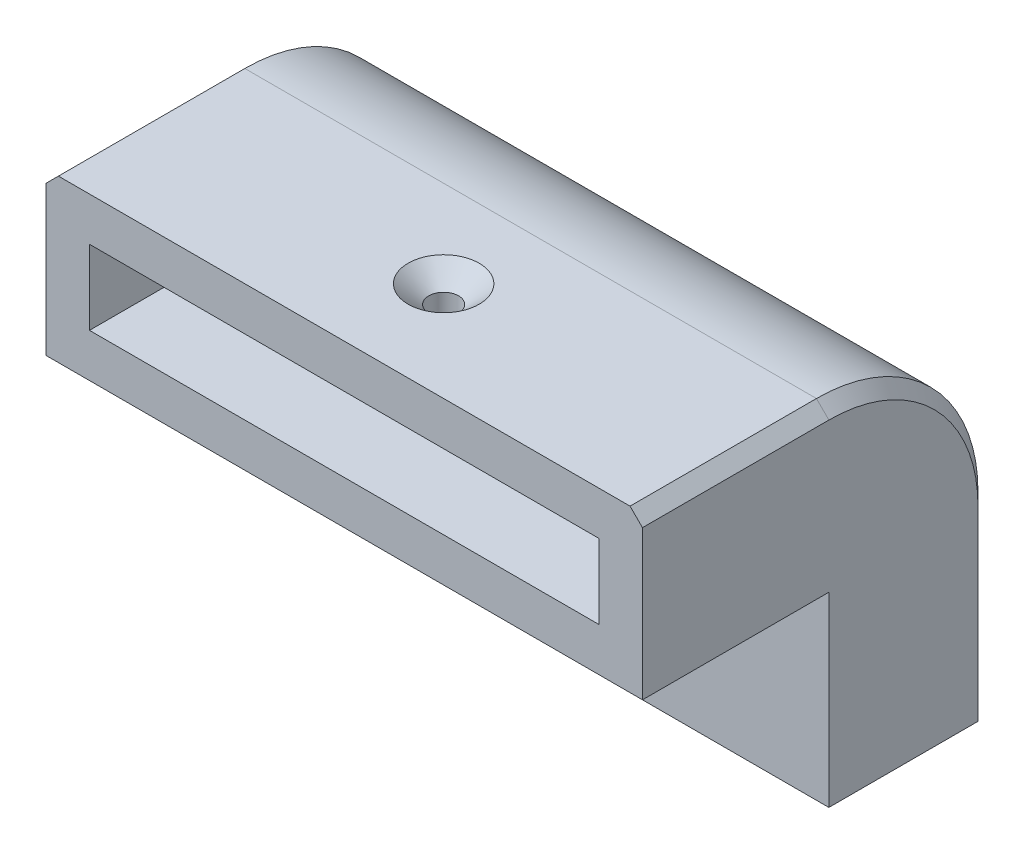
ISO-10303-21;
HEADER;
FILE_DESCRIPTION(('STEP AP214'),'2;1');
FILE_NAME('part.step','',(''),(''),'','','');
FILE_SCHEMA(('AUTOMOTIVE_DESIGN { 1 0 10303 214 1 1 1 1 }'));
ENDSEC;
DATA;
#1=APPLICATION_CONTEXT('core data for automotive mechanical design processes');
#2=APPLICATION_PROTOCOL_DEFINITION('international standard','automotive_design',2000,#1);
#3=PRODUCT_CONTEXT('',#1,'mechanical');
#4=PRODUCT('Part','Part','',(#3));
#5=PRODUCT_RELATED_PRODUCT_CATEGORY('part','',(#4));
#6=PRODUCT_DEFINITION_FORMATION('','',#4);
#7=PRODUCT_DEFINITION_CONTEXT('part definition',#1,'design');
#8=PRODUCT_DEFINITION('design','',#6,#7);
#9=PRODUCT_DEFINITION_SHAPE('','',#8);
#10=(LENGTH_UNIT() NAMED_UNIT(*) SI_UNIT(.MILLI.,.METRE.));
#11=(NAMED_UNIT(*) PLANE_ANGLE_UNIT() SI_UNIT($,.RADIAN.));
#12=(NAMED_UNIT(*) SI_UNIT($,.STERADIAN.) SOLID_ANGLE_UNIT());
#13=UNCERTAINTY_MEASURE_WITH_UNIT(LENGTH_MEASURE(1.E-05),#10,'distance_accuracy_value','');
#14=(GEOMETRIC_REPRESENTATION_CONTEXT(3) GLOBAL_UNCERTAINTY_ASSIGNED_CONTEXT((#13)) GLOBAL_UNIT_ASSIGNED_CONTEXT((#10,
#11,#12)) REPRESENTATION_CONTEXT('',''));
#15=CARTESIAN_POINT('',(0.,0.,0.));
#16=DIRECTION('',(0.,0.,1.));
#17=DIRECTION('',(1.,0.,0.));
#18=AXIS2_PLACEMENT_3D('',#15,#16,#17);
#19=CARTESIAN_POINT('',(0.,0.,0.));
#20=DIRECTION('',(0.,1.,0.));
#21=DIRECTION('',(0.,0.,1.));
#22=AXIS2_PLACEMENT_3D('',#19,#20,#21);
#23=PLANE('',#22);
#24=DIRECTION('',(0.,0.,1.));
#25=VECTOR('',#24,1.);
#26=CARTESIAN_POINT('',(26.035,0.,-3.81));
#27=LINE('',#26,#25);
#28=CARTESIAN_POINT('',(26.035,0.,-3.81));
#29=VERTEX_POINT('',#28);
#30=CARTESIAN_POINT('',(26.035,0.,3.81));
#31=VERTEX_POINT('',#30);
#32=EDGE_CURVE('E199',#29,#31,#27,.T.);
#33=ORIENTED_EDGE('',*,*,#32,.F.);
#34=DIRECTION('',(1.,0.,0.));
#35=VECTOR('',#34,1.);
#36=CARTESIAN_POINT('',(-26.035,0.,-3.81));
#37=LINE('',#36,#35);
#38=CARTESIAN_POINT('',(-26.035,0.,-3.81));
#39=VERTEX_POINT('',#38);
#40=EDGE_CURVE('E173',#39,#29,#37,.T.);
#41=ORIENTED_EDGE('',*,*,#40,.F.);
#42=DIRECTION('',(0.,0.,-1.));
#43=VECTOR('',#42,1.);
#44=CARTESIAN_POINT('',(-26.035,0.,3.81));
#45=LINE('',#44,#43);
#46=CARTESIAN_POINT('',(-26.035,0.,3.81));
#47=VERTEX_POINT('',#46);
#48=EDGE_CURVE('E190',#47,#39,#45,.T.);
#49=ORIENTED_EDGE('',*,*,#48,.F.);
#50=DIRECTION('',(-1.,0.,0.));
#51=VECTOR('',#50,1.);
#52=CARTESIAN_POINT('',(26.035,0.,3.81));
#53=LINE('',#52,#51);
#54=EDGE_CURVE('E193',#31,#47,#53,.T.);
#55=ORIENTED_EDGE('',*,*,#54,.F.);
#56=EDGE_LOOP('',(#33,#41,#49,#55));
#57=FACE_BOUND('',#56,.T.);
#58=DIRECTION('',(-1.,0.,0.));
#59=VECTOR('',#58,1.);
#60=CARTESIAN_POINT('',(-30.48,0.,-8.255));
#61=LINE('',#60,#59);
#62=CARTESIAN_POINT('',(29.21,0.,-8.25500000000001));
#63=VERTEX_POINT('',#62);
#64=CARTESIAN_POINT('',(-29.21,0.,-8.255));
#65=VERTEX_POINT('',#64);
#66=EDGE_CURVE('E391',#63,#65,#61,.T.);
#67=ORIENTED_EDGE('',*,*,#66,.F.);
#68=DIRECTION('',(-0.70710678118655,0.,-0.707106781186546));
#69=VECTOR('',#68,1.);
#70=CARTESIAN_POINT('',(29.21,0.,-8.255));
#71=LINE('',#70,#69);
#72=CARTESIAN_POINT('',(30.48,0.,-6.985));
#73=VERTEX_POINT('',#72);
#74=EDGE_CURVE('E341',#63,#73,#71,.F.);
#75=ORIENTED_EDGE('',*,*,#74,.T.);
#76=DIRECTION('',(0.,0.,-1.));
#77=VECTOR('',#76,1.);
#78=CARTESIAN_POINT('',(30.48,0.,-8.255));
#79=LINE('',#78,#77);
#80=CARTESIAN_POINT('',(30.48,0.,8.255));
#81=VERTEX_POINT('',#80);
#82=EDGE_CURVE('E349',#81,#73,#79,.T.);
#83=ORIENTED_EDGE('',*,*,#82,.F.);
#84=DIRECTION('',(1.,0.,0.));
#85=VECTOR('',#84,1.);
#86=CARTESIAN_POINT('',(-30.48,0.,8.255));
#87=LINE('',#86,#85);
#88=CARTESIAN_POINT('',(-30.48,0.,8.255));
#89=VERTEX_POINT('',#88);
#90=EDGE_CURVE('E397',#89,#81,#87,.T.);
#91=ORIENTED_EDGE('',*,*,#90,.F.);
#92=DIRECTION('',(0.,0.,1.));
#93=VECTOR('',#92,1.);
#94=CARTESIAN_POINT('',(-30.48,0.,-8.255));
#95=LINE('',#94,#93);
#96=CARTESIAN_POINT('',(-30.48,0.,-6.98499999999999));
#97=VERTEX_POINT('',#96);
#98=EDGE_CURVE('E262',#97,#89,#95,.T.);
#99=ORIENTED_EDGE('',*,*,#98,.F.);
#100=DIRECTION('',(-0.707106781186549,0.,0.707106781186546));
#101=VECTOR('',#100,1.);
#102=CARTESIAN_POINT('',(-30.48,0.,-6.98499999999999));
#103=LINE('',#102,#101);
#104=EDGE_CURVE('E344',#97,#65,#103,.F.);
#105=ORIENTED_EDGE('',*,*,#104,.T.);
#106=EDGE_LOOP('',(#67,#75,#83,#91,#99,#105));
#107=FACE_BOUND('',#106,.T.);
#108=ADVANCED_FACE('F33',(#57,#107),#23,.F.);
#109=CARTESIAN_POINT('',(-30.48,19.05,-8.255));
#110=DIRECTION('',(1.,0.,0.));
#111=DIRECTION('',(0.,0.,-1.));
#112=AXIS2_PLACEMENT_3D('',#109,#110,#111);
#113=PLANE('',#112);
#114=CARTESIAN_POINT('',(-30.48,19.05,8.255));
#115=DIRECTION('',(1.,0.,0.));
#116=DIRECTION('',(0.,0.,-1.));
#117=AXIS2_PLACEMENT_3D('',#114,#115,#116);
#118=CIRCLE('',#117,15.24);
#119=CARTESIAN_POINT('',(-30.48,34.29,8.25499999999995));
#120=VERTEX_POINT('',#119);
#121=CARTESIAN_POINT('',(-30.48,19.05,-6.985));
#122=VERTEX_POINT('',#121);
#123=EDGE_CURVE('E42',#120,#122,#118,.F.);
#124=ORIENTED_EDGE('',*,*,#123,.T.);
#125=DIRECTION('',(0.,-1.,0.));
#126=VECTOR('',#125,1.);
#127=CARTESIAN_POINT('',(-30.48,19.05,-6.98499999999999));
#128=LINE('',#127,#126);
#129=EDGE_CURVE('E11',#122,#97,#128,.T.);
#130=ORIENTED_EDGE('',*,*,#129,.T.);
#131=ORIENTED_EDGE('',*,*,#98,.T.);
#132=DIRECTION('',(0.,-1.,0.));
#133=VECTOR('',#132,1.);
#134=CARTESIAN_POINT('',(-30.48,19.05,8.255));
#135=LINE('',#134,#133);
#136=CARTESIAN_POINT('',(-30.48,19.05,8.255));
#137=VERTEX_POINT('',#136);
#138=EDGE_CURVE('E381',#137,#89,#135,.T.);
#139=ORIENTED_EDGE('',*,*,#138,.F.);
#140=DIRECTION('',(0.,0.,1.));
#141=VECTOR('',#140,1.);
#142=CARTESIAN_POINT('',(-30.48,19.05,-8.25500000000001));
#143=LINE('',#142,#141);
#144=CARTESIAN_POINT('',(-30.48,19.0500000000001,27.305));
#145=VERTEX_POINT('',#144);
#146=EDGE_CURVE('E254',#137,#145,#143,.T.);
#147=ORIENTED_EDGE('',*,*,#146,.T.);
#148=DIRECTION('',(0.,1.,0.));
#149=VECTOR('',#148,1.);
#150=CARTESIAN_POINT('',(-30.48,35.5600000000001,27.3049999999999));
#151=LINE('',#150,#149);
#152=CARTESIAN_POINT('',(-30.48,34.29,27.305));
#153=VERTEX_POINT('',#152);
#154=EDGE_CURVE('E252',#145,#153,#151,.T.);
#155=ORIENTED_EDGE('',*,*,#154,.T.);
#156=DIRECTION('',(0.,0.,-1.));
#157=VECTOR('',#156,1.);
#158=CARTESIAN_POINT('',(-30.48,34.29,8.25499999999995));
#159=LINE('',#158,#157);
#160=EDGE_CURVE('E53',#153,#120,#159,.T.);
#161=ORIENTED_EDGE('',*,*,#160,.T.);
#162=EDGE_LOOP('',(#124,#130,#131,#139,#147,#155,#161));
#163=FACE_BOUND('',#162,.T.);
#164=ADVANCED_FACE('F403',(#163),#113,.F.);
#165=CARTESIAN_POINT('',(-30.48,19.05,8.255));
#166=DIRECTION('',(0.,0.,-1.));
#167=DIRECTION('',(-1.,0.,0.));
#168=AXIS2_PLACEMENT_3D('',#165,#166,#167);
#169=PLANE('',#168);
#170=CARTESIAN_POINT('',(0.,10.16,8.255));
#171=DIRECTION('',(0.,0.,-1.));
#172=DIRECTION('',(-1.,0.,0.));
#173=AXIS2_PLACEMENT_3D('',#170,#171,#172);
#174=CIRCLE('',#173,3.35663030066415);
#175=CARTESIAN_POINT('',(-3.35663030066415,10.16,8.255));
#176=VERTEX_POINT('',#175);
#177=EDGE_CURVE('E372',#176,#176,#174,.T.);
#178=ORIENTED_EDGE('',*,*,#177,.T.);
#179=EDGE_LOOP('',(#178));
#180=FACE_BOUND('',#179,.T.);
#181=ORIENTED_EDGE('',*,*,#90,.T.);
#182=DIRECTION('',(0.,-1.,0.));
#183=VECTOR('',#182,1.);
#184=CARTESIAN_POINT('',(30.48,19.05,8.255));
#185=LINE('',#184,#183);
#186=CARTESIAN_POINT('',(30.48,19.05,8.255));
#187=VERTEX_POINT('',#186);
#188=EDGE_CURVE('E386',#187,#81,#185,.T.);
#189=ORIENTED_EDGE('',*,*,#188,.F.);
#190=DIRECTION('',(1.,0.,0.));
#191=VECTOR('',#190,1.);
#192=CARTESIAN_POINT('',(-30.48,19.05,8.255));
#193=LINE('',#192,#191);
#194=EDGE_CURVE('E387',#137,#187,#193,.T.);
#195=ORIENTED_EDGE('',*,*,#194,.F.);
#196=ORIENTED_EDGE('',*,*,#138,.T.);
#197=EDGE_LOOP('',(#181,#189,#195,#196));
#198=FACE_BOUND('',#197,.T.);
#199=ADVANCED_FACE('F407',(#180,#198),#169,.F.);
#200=CARTESIAN_POINT('',(30.48,19.05,-8.255));
#201=DIRECTION('',(-1.,0.,0.));
#202=DIRECTION('',(0.,0.,1.));
#203=AXIS2_PLACEMENT_3D('',#200,#201,#202);
#204=PLANE('',#203);
#205=ORIENTED_EDGE('',*,*,#82,.T.);
#206=DIRECTION('',(0.,1.,0.));
#207=VECTOR('',#206,1.);
#208=CARTESIAN_POINT('',(30.48,19.05,-6.985));
#209=LINE('',#208,#207);
#210=CARTESIAN_POINT('',(30.48,19.05,-6.98500000000001));
#211=VERTEX_POINT('',#210);
#212=EDGE_CURVE('E309',#73,#211,#209,.T.);
#213=ORIENTED_EDGE('',*,*,#212,.T.);
#214=CARTESIAN_POINT('',(30.48,19.05,8.255));
#215=DIRECTION('',(-1.,0.,0.));
#216=DIRECTION('',(0.,0.,1.));
#217=AXIS2_PLACEMENT_3D('',#214,#215,#216);
#218=CIRCLE('',#217,15.24);
#219=CARTESIAN_POINT('',(30.48,34.29,8.25499999999995));
#220=VERTEX_POINT('',#219);
#221=EDGE_CURVE('E340',#211,#220,#218,.F.);
#222=ORIENTED_EDGE('',*,*,#221,.T.);
#223=DIRECTION('',(0.,0.,1.));
#224=VECTOR('',#223,1.);
#225=CARTESIAN_POINT('',(30.48,34.2900000000001,27.305));
#226=LINE('',#225,#224);
#227=CARTESIAN_POINT('',(30.48,34.29,27.305));
#228=VERTEX_POINT('',#227);
#229=EDGE_CURVE('E296',#220,#228,#226,.T.);
#230=ORIENTED_EDGE('',*,*,#229,.T.);
#231=DIRECTION('',(0.,-1.,0.));
#232=VECTOR('',#231,1.);
#233=CARTESIAN_POINT('',(30.48,35.5600000000001,27.3049999999999));
#234=LINE('',#233,#232);
#235=CARTESIAN_POINT('',(30.48,19.0500000000001,27.305));
#236=VERTEX_POINT('',#235);
#237=EDGE_CURVE('E251',#228,#236,#234,.T.);
#238=ORIENTED_EDGE('',*,*,#237,.T.);
#239=DIRECTION('',(0.,0.,-1.));
#240=VECTOR('',#239,1.);
#241=CARTESIAN_POINT('',(30.48,19.05,-8.25500000000001));
#242=LINE('',#241,#240);
#243=EDGE_CURVE('E265',#236,#187,#242,.T.);
#244=ORIENTED_EDGE('',*,*,#243,.T.);
#245=ORIENTED_EDGE('',*,*,#188,.T.);
#246=EDGE_LOOP('',(#205,#213,#222,#230,#238,#244,#245));
#247=FACE_BOUND('',#246,.T.);
#248=ADVANCED_FACE('F338',(#247),#204,.F.);
#249=CARTESIAN_POINT('',(-30.48,19.05,-8.255));
#250=DIRECTION('',(0.,0.,1.));
#251=DIRECTION('',(1.,0.,0.));
#252=AXIS2_PLACEMENT_3D('',#249,#250,#251);
#253=PLANE('',#252);
#254=CARTESIAN_POINT('',(0.,10.16,-8.255));
#255=DIRECTION('',(0.,0.,-1.));
#256=DIRECTION('',(-1.,0.,0.));
#257=AXIS2_PLACEMENT_3D('',#254,#255,#256);
#258=CIRCLE('',#257,1.524);
#259=CARTESIAN_POINT('',(-1.524,10.16,-8.255));
#260=VERTEX_POINT('',#259);
#261=EDGE_CURVE('E247',#260,#260,#258,.T.);
#262=ORIENTED_EDGE('',*,*,#261,.F.);
#263=EDGE_LOOP('',(#262));
#264=FACE_BOUND('',#263,.T.);
#265=DIRECTION('',(-1.,0.,0.));
#266=VECTOR('',#265,1.);
#267=CARTESIAN_POINT('',(-30.48,19.05,-8.255));
#268=LINE('',#267,#266);
#269=CARTESIAN_POINT('',(29.21,19.05,-8.255));
#270=VERTEX_POINT('',#269);
#271=CARTESIAN_POINT('',(-29.21,19.05,-8.255));
#272=VERTEX_POINT('',#271);
#273=EDGE_CURVE('E390',#270,#272,#268,.T.);
#274=ORIENTED_EDGE('',*,*,#273,.F.);
#275=DIRECTION('',(0.,-1.,0.));
#276=VECTOR('',#275,1.);
#277=CARTESIAN_POINT('',(29.21,19.05,-8.255));
#278=LINE('',#277,#276);
#279=EDGE_CURVE('E353',#270,#63,#278,.T.);
#280=ORIENTED_EDGE('',*,*,#279,.T.);
#281=ORIENTED_EDGE('',*,*,#66,.T.);
#282=DIRECTION('',(0.,1.,0.));
#283=VECTOR('',#282,1.);
#284=CARTESIAN_POINT('',(-29.21,19.05,-8.255));
#285=LINE('',#284,#283);
#286=EDGE_CURVE('E357',#65,#272,#285,.T.);
#287=ORIENTED_EDGE('',*,*,#286,.T.);
#288=EDGE_LOOP('',(#274,#280,#281,#287));
#289=FACE_BOUND('',#288,.T.);
#290=ADVANCED_FACE('F399',(#264,#289),#253,.F.);
#291=CARTESIAN_POINT('',(-69.6857865627002,19.05,8.255));
#292=DIRECTION('',(1.,0.,0.));
#293=DIRECTION('',(0.,0.,-1.));
#294=AXIS2_PLACEMENT_3D('',#291,#292,#293);
#295=CYLINDRICAL_SURFACE('',#294,16.51);
#296=DIRECTION('',(1.,0.,0.));
#297=VECTOR('',#296,1.);
#298=CARTESIAN_POINT('',(-69.6857865627002,35.56,8.25499999999994));
#299=LINE('',#298,#297);
#300=CARTESIAN_POINT('',(-29.21,35.56,8.25499999999994));
#301=VERTEX_POINT('',#300);
#302=CARTESIAN_POINT('',(29.21,35.56,8.25499999999994));
#303=VERTEX_POINT('',#302);
#304=EDGE_CURVE('E263',#301,#303,#299,.T.);
#305=ORIENTED_EDGE('',*,*,#304,.T.);
#306=CARTESIAN_POINT('',(29.21,19.05,8.255));
#307=DIRECTION('',(-1.,0.,0.));
#308=DIRECTION('',(0.,0.,1.));
#309=AXIS2_PLACEMENT_3D('',#306,#307,#308);
#310=CIRCLE('',#309,16.51);
#311=EDGE_CURVE('E285',#303,#270,#310,.T.);
#312=ORIENTED_EDGE('',*,*,#311,.T.);
#313=ORIENTED_EDGE('',*,*,#273,.T.);
#314=CARTESIAN_POINT('',(-29.21,19.05,8.255));
#315=DIRECTION('',(1.,0.,0.));
#316=DIRECTION('',(0.,0.,-1.));
#317=AXIS2_PLACEMENT_3D('',#314,#315,#316);
#318=CIRCLE('',#317,16.51);
#319=EDGE_CURVE('E288',#272,#301,#318,.T.);
#320=ORIENTED_EDGE('',*,*,#319,.T.);
#321=EDGE_LOOP('',(#305,#312,#313,#320));
#322=FACE_BOUND('',#321,.T.);
#323=ADVANCED_FACE('F282',(#322),#295,.T.);
#324=CARTESIAN_POINT('',(-69.6857865627002,19.05,-8.25500000000001));
#325=DIRECTION('',(0.,-1.,0.));
#326=DIRECTION('',(0.,0.,-1.));
#327=AXIS2_PLACEMENT_3D('',#324,#325,#326);
#328=PLANE('',#327);
#329=CARTESIAN_POINT('',(0.,19.05,17.145));
#330=DIRECTION('',(0.,-1.,0.));
#331=DIRECTION('',(0.,0.,-1.));
#332=AXIS2_PLACEMENT_3D('',#329,#330,#331);
#333=CIRCLE('',#332,1.524);
#334=CARTESIAN_POINT('',(0.,19.05,15.621));
#335=VERTEX_POINT('',#334);
#336=EDGE_CURVE('E244',#335,#335,#333,.T.);
#337=ORIENTED_EDGE('',*,*,#336,.F.);
#338=EDGE_LOOP('',(#337));
#339=FACE_BOUND('',#338,.T.);
#340=ORIENTED_EDGE('',*,*,#146,.F.);
#341=ORIENTED_EDGE('',*,*,#194,.T.);
#342=ORIENTED_EDGE('',*,*,#243,.F.);
#343=DIRECTION('',(1.,0.,0.));
#344=VECTOR('',#343,1.);
#345=CARTESIAN_POINT('',(-69.6857865627002,19.0500000000001,27.305));
#346=LINE('',#345,#344);
#347=EDGE_CURVE('E255',#145,#236,#346,.T.);
#348=ORIENTED_EDGE('',*,*,#347,.F.);
#349=EDGE_LOOP('',(#340,#341,#342,#348));
#350=FACE_BOUND('',#349,.T.);
#351=ADVANCED_FACE('F410',(#339,#350),#328,.T.);
#352=CARTESIAN_POINT('',(-69.6857865627002,35.5600000000001,27.3049999999999));
#353=DIRECTION('',(0.,0.,1.));
#354=DIRECTION('',(0.,-1.,0.));
#355=AXIS2_PLACEMENT_3D('',#352,#353,#354);
#356=PLANE('',#355);
#357=DIRECTION('',(1.,0.,0.));
#358=VECTOR('',#357,1.);
#359=CARTESIAN_POINT('',(-26.035,23.4950000000001,27.3050000000001));
#360=LINE('',#359,#358);
#361=CARTESIAN_POINT('',(-26.035,23.4950000000001,27.3050000000001));
#362=VERTEX_POINT('',#361);
#363=CARTESIAN_POINT('',(26.035,23.4950000000001,27.305));
#364=VERTEX_POINT('',#363);
#365=EDGE_CURVE('E224',#362,#364,#360,.T.);
#366=ORIENTED_EDGE('',*,*,#365,.F.);
#367=DIRECTION('',(0.,-1.,0.));
#368=VECTOR('',#367,1.);
#369=CARTESIAN_POINT('',(-26.035,31.1150000000001,27.3050000000001));
#370=LINE('',#369,#368);
#371=CARTESIAN_POINT('',(-26.035,31.1150000000001,27.3050000000001));
#372=VERTEX_POINT('',#371);
#373=EDGE_CURVE('E214',#372,#362,#370,.T.);
#374=ORIENTED_EDGE('',*,*,#373,.F.);
#375=DIRECTION('',(-1.,0.,0.));
#376=VECTOR('',#375,1.);
#377=CARTESIAN_POINT('',(26.035,31.1150000000001,27.3050000000001));
#378=LINE('',#377,#376);
#379=CARTESIAN_POINT('',(26.035,31.1150000000001,27.3050000000001));
#380=VERTEX_POINT('',#379);
#381=EDGE_CURVE('E230',#380,#372,#378,.T.);
#382=ORIENTED_EDGE('',*,*,#381,.F.);
#383=DIRECTION('',(0.,1.,0.));
#384=VECTOR('',#383,1.);
#385=CARTESIAN_POINT('',(26.035,23.4950000000001,27.3050000000001));
#386=LINE('',#385,#384);
#387=EDGE_CURVE('E226',#364,#380,#386,.T.);
#388=ORIENTED_EDGE('',*,*,#387,.F.);
#389=EDGE_LOOP('',(#366,#374,#382,#388));
#390=FACE_BOUND('',#389,.T.);
#391=ORIENTED_EDGE('',*,*,#237,.F.);
#392=DIRECTION('',(-0.707106781186548,0.707106781186547,0.));
#393=VECTOR('',#392,1.);
#394=CARTESIAN_POINT('',(-20.2378932813502,85.0078932813501,27.3049999999998));
#395=LINE('',#394,#393);
#396=CARTESIAN_POINT('',(29.21,35.5600000000001,27.3049999999999));
#397=VERTEX_POINT('',#396);
#398=EDGE_CURVE('E307',#228,#397,#395,.T.);
#399=ORIENTED_EDGE('',*,*,#398,.T.);
#400=DIRECTION('',(1.,0.,0.));
#401=VECTOR('',#400,1.);
#402=CARTESIAN_POINT('',(-69.6857865627002,35.5600000000001,27.3049999999999));
#403=LINE('',#402,#401);
#404=CARTESIAN_POINT('',(-29.21,35.5600000000001,27.3049999999999));
#405=VERTEX_POINT('',#404);
#406=EDGE_CURVE('E273',#405,#397,#403,.T.);
#407=ORIENTED_EDGE('',*,*,#406,.F.);
#408=DIRECTION('',(-0.707106781186548,-0.707106781186547,0.));
#409=VECTOR('',#408,1.);
#410=CARTESIAN_POINT('',(-49.4478932813501,15.32210671865,27.305));
#411=LINE('',#410,#409);
#412=EDGE_CURVE('E305',#405,#153,#411,.T.);
#413=ORIENTED_EDGE('',*,*,#412,.T.);
#414=ORIENTED_EDGE('',*,*,#154,.F.);
#415=ORIENTED_EDGE('',*,*,#347,.T.);
#416=EDGE_LOOP('',(#391,#399,#407,#413,#414,#415));
#417=FACE_BOUND('',#416,.T.);
#418=ADVANCED_FACE('F332',(#390,#417),#356,.T.);
#419=CARTESIAN_POINT('',(-69.6857865627002,35.56,8.25499999999994));
#420=DIRECTION('',(0.,1.,0.));
#421=DIRECTION('',(0.,0.,1.));
#422=AXIS2_PLACEMENT_3D('',#419,#420,#421);
#423=PLANE('',#422);
#424=CARTESIAN_POINT('',(0.,35.56,17.145));
#425=DIRECTION('',(0.,1.,0.));
#426=DIRECTION('',(0.,0.,1.));
#427=AXIS2_PLACEMENT_3D('',#424,#425,#426);
#428=CIRCLE('',#427,3.63220000000003);
#429=CARTESIAN_POINT('',(0.,35.5600000000001,20.7772));
#430=VERTEX_POINT('',#429);
#431=EDGE_CURVE('E375',#430,#430,#428,.F.);
#432=ORIENTED_EDGE('',*,*,#431,.T.);
#433=EDGE_LOOP('',(#432));
#434=FACE_BOUND('',#433,.T.);
#435=ORIENTED_EDGE('',*,*,#406,.T.);
#436=DIRECTION('',(0.,0.,-1.));
#437=VECTOR('',#436,1.);
#438=CARTESIAN_POINT('',(29.21,35.56,8.25499999999994));
#439=LINE('',#438,#437);
#440=EDGE_CURVE('E295',#397,#303,#439,.T.);
#441=ORIENTED_EDGE('',*,*,#440,.T.);
#442=ORIENTED_EDGE('',*,*,#304,.F.);
#443=DIRECTION('',(0.,0.,1.));
#444=VECTOR('',#443,1.);
#445=CARTESIAN_POINT('',(-29.21,35.5600000000001,27.3049999999999));
#446=LINE('',#445,#444);
#447=EDGE_CURVE('E314',#301,#405,#446,.T.);
#448=ORIENTED_EDGE('',*,*,#447,.T.);
#449=EDGE_LOOP('',(#435,#441,#442,#448));
#450=FACE_BOUND('',#449,.T.);
#451=ADVANCED_FACE('F329',(#434,#450),#423,.T.);
#452=CARTESIAN_POINT('',(0.,10.16,27.305025));
#453=DIRECTION('',(0.,0.,-1.));
#454=DIRECTION('',(-1.,0.,0.));
#455=AXIS2_PLACEMENT_3D('',#452,#453,#454);
#456=CYLINDRICAL_SURFACE('',#455,1.524);
#457=CARTESIAN_POINT('',(0.,10.16,3.81));
#458=DIRECTION('',(0.,0.,1.));
#459=DIRECTION('',(1.,0.,0.));
#460=AXIS2_PLACEMENT_3D('',#457,#458,#459);
#461=CIRCLE('',#460,1.524);
#462=CARTESIAN_POINT('',(1.524,10.16,3.81));
#463=VERTEX_POINT('',#462);
#464=EDGE_CURVE('E227',#463,#463,#461,.F.);
#465=ORIENTED_EDGE('',*,*,#464,.T.);
#466=EDGE_LOOP('',(#465));
#467=FACE_BOUND('',#466,.T.);
#468=CARTESIAN_POINT('',(0.,10.16,6.14680000000001));
#469=DIRECTION('',(0.,0.,-1.));
#470=DIRECTION('',(-1.,0.,0.));
#471=AXIS2_PLACEMENT_3D('',#468,#469,#470);
#472=CIRCLE('',#471,1.524);
#473=CARTESIAN_POINT('',(-1.524,10.16,6.14680000000001));
#474=VERTEX_POINT('',#473);
#475=EDGE_CURVE('E359',#474,#474,#472,.F.);
#476=ORIENTED_EDGE('',*,*,#475,.T.);
#477=EDGE_LOOP('',(#476));
#478=FACE_BOUND('',#477,.T.);
#479=ADVANCED_FACE('F582',(#467,#478),#456,.F.);
#480=CARTESIAN_POINT('',(0.,10.16,-3.81));
#481=DIRECTION('',(0.,0.,-1.));
#482=DIRECTION('',(-1.,0.,0.));
#483=AXIS2_PLACEMENT_3D('',#480,#481,#482);
#484=CIRCLE('',#483,1.524);
#485=CARTESIAN_POINT('',(-1.524,10.16,-3.81));
#486=VERTEX_POINT('',#485);
#487=EDGE_CURVE('E206',#486,#486,#484,.F.);
#488=ORIENTED_EDGE('',*,*,#487,.T.);
#489=EDGE_LOOP('',(#488));
#490=FACE_BOUND('',#489,.T.);
#491=ORIENTED_EDGE('',*,*,#261,.T.);
#492=EDGE_LOOP('',(#491));
#493=FACE_BOUND('',#492,.T.);
#494=ADVANCED_FACE('F574',(#490,#493),#456,.F.);
#495=CARTESIAN_POINT('',(0.,-2.50000000354134E-05,17.1450000000001));
#496=DIRECTION('',(0.,1.,0.));
#497=DIRECTION('',(0.,0.,1.));
#498=AXIS2_PLACEMENT_3D('',#495,#496,#497);
#499=CYLINDRICAL_SURFACE('',#498,1.524);
#500=CARTESIAN_POINT('',(0.,31.1150000000001,17.145));
#501=DIRECTION('',(0.,1.,0.));
#502=DIRECTION('',(0.,0.,1.));
#503=AXIS2_PLACEMENT_3D('',#500,#501,#502);
#504=CIRCLE('',#503,1.524);
#505=CARTESIAN_POINT('',(0.,31.1150000000001,18.669));
#506=VERTEX_POINT('',#505);
#507=EDGE_CURVE('E248',#506,#506,#504,.F.);
#508=ORIENTED_EDGE('',*,*,#507,.T.);
#509=EDGE_LOOP('',(#508));
#510=FACE_BOUND('',#509,.T.);
#511=CARTESIAN_POINT('',(0.,33.7273696993359,17.145));
#512=DIRECTION('',(0.,1.,0.));
#513=DIRECTION('',(0.,0.,1.));
#514=AXIS2_PLACEMENT_3D('',#511,#512,#513);
#515=CIRCLE('',#514,1.524);
#516=CARTESIAN_POINT('',(0.,33.7273696993359,18.669));
#517=VERTEX_POINT('',#516);
#518=EDGE_CURVE('E378',#517,#517,#515,.T.);
#519=ORIENTED_EDGE('',*,*,#518,.T.);
#520=EDGE_LOOP('',(#519));
#521=FACE_BOUND('',#520,.T.);
#522=ADVANCED_FACE('F565',(#510,#521),#499,.F.);
#523=CARTESIAN_POINT('',(0.,23.4950000000001,17.145));
#524=DIRECTION('',(0.,-1.,0.));
#525=DIRECTION('',(0.,0.,-1.));
#526=AXIS2_PLACEMENT_3D('',#523,#524,#525);
#527=CIRCLE('',#526,1.524);
#528=CARTESIAN_POINT('',(0.,23.4950000000001,15.621));
#529=VERTEX_POINT('',#528);
#530=EDGE_CURVE('E237',#529,#529,#527,.F.);
#531=ORIENTED_EDGE('',*,*,#530,.T.);
#532=EDGE_LOOP('',(#531));
#533=FACE_BOUND('',#532,.T.);
#534=ORIENTED_EDGE('',*,*,#336,.T.);
#535=EDGE_LOOP('',(#534));
#536=FACE_BOUND('',#535,.T.);
#537=ADVANCED_FACE('F446',(#533,#536),#499,.F.);
#538=CARTESIAN_POINT('',(0.,33.7273696993359,17.145));
#539=DIRECTION('',(0.,1.,0.));
#540=DIRECTION('',(0.,0.,1.));
#541=AXIS2_PLACEMENT_3D('',#538,#539,#540);
#542=CONICAL_SURFACE('',#541,1.524,0.855211333477226);
#543=ORIENTED_EDGE('',*,*,#431,.F.);
#544=EDGE_LOOP('',(#543));
#545=FACE_BOUND('',#544,.T.);
#546=ORIENTED_EDGE('',*,*,#518,.F.);
#547=EDGE_LOOP('',(#546));
#548=FACE_BOUND('',#547,.T.);
#549=ADVANCED_FACE('F442',(#545,#548),#542,.F.);
#550=CARTESIAN_POINT('',(0.,10.16,8.255));
#551=DIRECTION('',(0.,0.,1.));
#552=DIRECTION('',(1.,0.,0.));
#553=AXIS2_PLACEMENT_3D('',#550,#551,#552);
#554=CONICAL_SURFACE('',#553,3.35663030066415,0.715584993317671);
#555=ORIENTED_EDGE('',*,*,#475,.F.);
#556=EDGE_LOOP('',(#555));
#557=FACE_BOUND('',#556,.T.);
#558=ORIENTED_EDGE('',*,*,#177,.F.);
#559=EDGE_LOOP('',(#558));
#560=FACE_BOUND('',#559,.T.);
#561=ADVANCED_FACE('F445',(#557,#560),#554,.F.);
#562=CARTESIAN_POINT('',(26.035,31.1150000000001,8.25500000000007));
#563=DIRECTION('',(0.,1.,0.));
#564=DIRECTION('',(0.,0.,1.));
#565=AXIS2_PLACEMENT_3D('',#562,#563,#564);
#566=PLANE('',#565);
#567=ORIENTED_EDGE('',*,*,#381,.T.);
#568=DIRECTION('',(0.,0.,1.));
#569=VECTOR('',#568,1.);
#570=CARTESIAN_POINT('',(-26.035,31.1150000000001,8.25500000000007));
#571=LINE('',#570,#569);
#572=CARTESIAN_POINT('',(-26.035,31.1150000000001,8.25500000000007));
#573=VERTEX_POINT('',#572);
#574=EDGE_CURVE('E238',#573,#372,#571,.T.);
#575=ORIENTED_EDGE('',*,*,#574,.F.);
#576=DIRECTION('',(-1.,0.,0.));
#577=VECTOR('',#576,1.);
#578=CARTESIAN_POINT('',(26.035,31.1150000000001,8.25500000000007));
#579=LINE('',#578,#577);
#580=CARTESIAN_POINT('',(26.035,31.1150000000001,8.25500000000007));
#581=VERTEX_POINT('',#580);
#582=EDGE_CURVE('E217',#581,#573,#579,.T.);
#583=ORIENTED_EDGE('',*,*,#582,.F.);
#584=DIRECTION('',(0.,0.,1.));
#585=VECTOR('',#584,1.);
#586=CARTESIAN_POINT('',(26.035,31.1150000000001,8.25500000000007));
#587=LINE('',#586,#585);
#588=EDGE_CURVE('E240',#581,#380,#587,.T.);
#589=ORIENTED_EDGE('',*,*,#588,.T.);
#590=EDGE_LOOP('',(#567,#575,#583,#589));
#591=FACE_BOUND('',#590,.T.);
#592=ORIENTED_EDGE('',*,*,#507,.F.);
#593=EDGE_LOOP('',(#592));
#594=FACE_BOUND('',#593,.T.);
#595=ADVANCED_FACE('F450',(#591,#594),#566,.F.);
#596=CARTESIAN_POINT('',(-26.035,23.4950000000001,8.25500000000007));
#597=DIRECTION('',(0.,-1.,0.));
#598=DIRECTION('',(0.,0.,-1.));
#599=AXIS2_PLACEMENT_3D('',#596,#597,#598);
#600=PLANE('',#599);
#601=ORIENTED_EDGE('',*,*,#365,.T.);
#602=DIRECTION('',(0.,0.,1.));
#603=VECTOR('',#602,1.);
#604=CARTESIAN_POINT('',(26.035,23.4950000000001,8.25500000000007));
#605=LINE('',#604,#603);
#606=CARTESIAN_POINT('',(26.035,23.4950000000001,8.25500000000007));
#607=VERTEX_POINT('',#606);
#608=EDGE_CURVE('E223',#607,#364,#605,.T.);
#609=ORIENTED_EDGE('',*,*,#608,.F.);
#610=DIRECTION('',(1.,0.,0.));
#611=VECTOR('',#610,1.);
#612=CARTESIAN_POINT('',(-26.035,23.4950000000001,8.25500000000007));
#613=LINE('',#612,#611);
#614=CARTESIAN_POINT('',(-26.035,23.4950000000001,8.25500000000007));
#615=VERTEX_POINT('',#614);
#616=EDGE_CURVE('E210',#615,#607,#613,.T.);
#617=ORIENTED_EDGE('',*,*,#616,.F.);
#618=DIRECTION('',(0.,0.,1.));
#619=VECTOR('',#618,1.);
#620=CARTESIAN_POINT('',(-26.035,23.4950000000001,8.25500000000007));
#621=LINE('',#620,#619);
#622=EDGE_CURVE('E235',#615,#362,#621,.T.);
#623=ORIENTED_EDGE('',*,*,#622,.T.);
#624=EDGE_LOOP('',(#601,#609,#617,#623));
#625=FACE_BOUND('',#624,.T.);
#626=ORIENTED_EDGE('',*,*,#530,.F.);
#627=EDGE_LOOP('',(#626));
#628=FACE_BOUND('',#627,.T.);
#629=ADVANCED_FACE('F533',(#625,#628),#600,.F.);
#630=CARTESIAN_POINT('',(-26.035,31.1150000000001,8.25500000000007));
#631=DIRECTION('',(-1.,0.,0.));
#632=DIRECTION('',(0.,0.,1.));
#633=AXIS2_PLACEMENT_3D('',#630,#631,#632);
#634=PLANE('',#633);
#635=ORIENTED_EDGE('',*,*,#373,.T.);
#636=ORIENTED_EDGE('',*,*,#622,.F.);
#637=DIRECTION('',(0.,-1.,0.));
#638=VECTOR('',#637,1.);
#639=CARTESIAN_POINT('',(-26.035,31.1150000000001,8.25500000000007));
#640=LINE('',#639,#638);
#641=EDGE_CURVE('E220',#573,#615,#640,.T.);
#642=ORIENTED_EDGE('',*,*,#641,.F.);
#643=ORIENTED_EDGE('',*,*,#574,.T.);
#644=EDGE_LOOP('',(#635,#636,#642,#643));
#645=FACE_BOUND('',#644,.T.);
#646=ADVANCED_FACE('F525',(#645),#634,.F.);
#647=CARTESIAN_POINT('',(26.035,23.4950000000001,8.25500000000007));
#648=DIRECTION('',(1.,0.,0.));
#649=DIRECTION('',(0.,0.,-1.));
#650=AXIS2_PLACEMENT_3D('',#647,#648,#649);
#651=PLANE('',#650);
#652=ORIENTED_EDGE('',*,*,#387,.T.);
#653=ORIENTED_EDGE('',*,*,#588,.F.);
#654=DIRECTION('',(0.,1.,0.));
#655=VECTOR('',#654,1.);
#656=CARTESIAN_POINT('',(26.035,23.4950000000001,8.25500000000007));
#657=LINE('',#656,#655);
#658=EDGE_CURVE('E213',#607,#581,#657,.T.);
#659=ORIENTED_EDGE('',*,*,#658,.F.);
#660=ORIENTED_EDGE('',*,*,#608,.T.);
#661=EDGE_LOOP('',(#652,#653,#659,#660));
#662=FACE_BOUND('',#661,.T.);
#663=ADVANCED_FACE('F517',(#662),#651,.F.);
#664=CARTESIAN_POINT('',(0.,0.,8.25500000000007));
#665=DIRECTION('',(0.,0.,1.));
#666=DIRECTION('',(1.,0.,0.));
#667=AXIS2_PLACEMENT_3D('',#664,#665,#666);
#668=PLANE('',#667);
#669=ORIENTED_EDGE('',*,*,#616,.T.);
#670=ORIENTED_EDGE('',*,*,#658,.T.);
#671=ORIENTED_EDGE('',*,*,#582,.T.);
#672=ORIENTED_EDGE('',*,*,#641,.T.);
#673=EDGE_LOOP('',(#669,#670,#671,#672));
#674=FACE_BOUND('',#673,.T.);
#675=ADVANCED_FACE('F508',(#674),#668,.T.);
#676=CARTESIAN_POINT('',(26.035,19.05,3.81));
#677=DIRECTION('',(0.,0.,1.));
#678=DIRECTION('',(1.,0.,0.));
#679=AXIS2_PLACEMENT_3D('',#676,#677,#678);
#680=PLANE('',#679);
#681=ORIENTED_EDGE('',*,*,#54,.T.);
#682=DIRECTION('',(0.,-1.,0.));
#683=VECTOR('',#682,1.);
#684=CARTESIAN_POINT('',(-26.035,19.05,3.81));
#685=LINE('',#684,#683);
#686=CARTESIAN_POINT('',(-26.035,19.05,3.81));
#687=VERTEX_POINT('',#686);
#688=EDGE_CURVE('E207',#687,#47,#685,.T.);
#689=ORIENTED_EDGE('',*,*,#688,.F.);
#690=DIRECTION('',(-1.,0.,0.));
#691=VECTOR('',#690,1.);
#692=CARTESIAN_POINT('',(26.035,19.05,3.81));
#693=LINE('',#692,#691);
#694=CARTESIAN_POINT('',(26.035,19.05,3.81));
#695=VERTEX_POINT('',#694);
#696=EDGE_CURVE('E186',#695,#687,#693,.T.);
#697=ORIENTED_EDGE('',*,*,#696,.F.);
#698=DIRECTION('',(0.,-1.,0.));
#699=VECTOR('',#698,1.);
#700=CARTESIAN_POINT('',(26.035,19.05,3.81));
#701=LINE('',#700,#699);
#702=EDGE_CURVE('E177',#695,#31,#701,.T.);
#703=ORIENTED_EDGE('',*,*,#702,.T.);
#704=EDGE_LOOP('',(#681,#689,#697,#703));
#705=FACE_BOUND('',#704,.T.);
#706=ORIENTED_EDGE('',*,*,#464,.F.);
#707=EDGE_LOOP('',(#706));
#708=FACE_BOUND('',#707,.T.);
#709=ADVANCED_FACE('F501',(#705,#708),#680,.F.);
#710=CARTESIAN_POINT('',(-26.035,19.05,-3.81));
#711=DIRECTION('',(0.,0.,-1.));
#712=DIRECTION('',(-1.,0.,0.));
#713=AXIS2_PLACEMENT_3D('',#710,#711,#712);
#714=PLANE('',#713);
#715=ORIENTED_EDGE('',*,*,#40,.T.);
#716=DIRECTION('',(0.,-1.,0.));
#717=VECTOR('',#716,1.);
#718=CARTESIAN_POINT('',(26.035,19.05,-3.81));
#719=LINE('',#718,#717);
#720=CARTESIAN_POINT('',(26.035,19.05,-3.81));
#721=VERTEX_POINT('',#720);
#722=EDGE_CURVE('E165',#721,#29,#719,.T.);
#723=ORIENTED_EDGE('',*,*,#722,.F.);
#724=DIRECTION('',(1.,0.,0.));
#725=VECTOR('',#724,1.);
#726=CARTESIAN_POINT('',(-26.035,19.05,-3.81));
#727=LINE('',#726,#725);
#728=CARTESIAN_POINT('',(-26.035,19.05,-3.81));
#729=VERTEX_POINT('',#728);
#730=EDGE_CURVE('E170',#729,#721,#727,.T.);
#731=ORIENTED_EDGE('',*,*,#730,.F.);
#732=DIRECTION('',(0.,-1.,0.));
#733=VECTOR('',#732,1.);
#734=CARTESIAN_POINT('',(-26.035,19.05,-3.81));
#735=LINE('',#734,#733);
#736=EDGE_CURVE('E204',#729,#39,#735,.T.);
#737=ORIENTED_EDGE('',*,*,#736,.T.);
#738=EDGE_LOOP('',(#715,#723,#731,#737));
#739=FACE_BOUND('',#738,.T.);
#740=ORIENTED_EDGE('',*,*,#487,.F.);
#741=EDGE_LOOP('',(#740));
#742=FACE_BOUND('',#741,.T.);
#743=ADVANCED_FACE('F167',(#739,#742),#714,.F.);
#744=CARTESIAN_POINT('',(-26.035,19.05,3.81));
#745=DIRECTION('',(-1.,0.,0.));
#746=DIRECTION('',(0.,0.,1.));
#747=AXIS2_PLACEMENT_3D('',#744,#745,#746);
#748=PLANE('',#747);
#749=ORIENTED_EDGE('',*,*,#48,.T.);
#750=ORIENTED_EDGE('',*,*,#736,.F.);
#751=DIRECTION('',(0.,0.,-1.));
#752=VECTOR('',#751,1.);
#753=CARTESIAN_POINT('',(-26.035,19.05,3.81));
#754=LINE('',#753,#752);
#755=EDGE_CURVE('E178',#687,#729,#754,.T.);
#756=ORIENTED_EDGE('',*,*,#755,.F.);
#757=ORIENTED_EDGE('',*,*,#688,.T.);
#758=EDGE_LOOP('',(#749,#750,#756,#757));
#759=FACE_BOUND('',#758,.T.);
#760=ADVANCED_FACE('F487',(#759),#748,.F.);
#761=CARTESIAN_POINT('',(26.035,19.05,-3.81));
#762=DIRECTION('',(1.,0.,0.));
#763=DIRECTION('',(0.,0.,-1.));
#764=AXIS2_PLACEMENT_3D('',#761,#762,#763);
#765=PLANE('',#764);
#766=ORIENTED_EDGE('',*,*,#32,.T.);
#767=ORIENTED_EDGE('',*,*,#702,.F.);
#768=DIRECTION('',(0.,0.,1.));
#769=VECTOR('',#768,1.);
#770=CARTESIAN_POINT('',(26.035,19.05,-3.81));
#771=LINE('',#770,#769);
#772=EDGE_CURVE('E181',#721,#695,#771,.T.);
#773=ORIENTED_EDGE('',*,*,#772,.F.);
#774=ORIENTED_EDGE('',*,*,#722,.T.);
#775=EDGE_LOOP('',(#766,#767,#773,#774));
#776=FACE_BOUND('',#775,.T.);
#777=ADVANCED_FACE('F182',(#776),#765,.F.);
#778=ORIENTED_EDGE('',*,*,#730,.T.);
#779=ORIENTED_EDGE('',*,*,#772,.T.);
#780=ORIENTED_EDGE('',*,*,#696,.T.);
#781=ORIENTED_EDGE('',*,*,#755,.T.);
#782=EDGE_LOOP('',(#778,#779,#780,#781));
#783=FACE_BOUND('',#782,.T.);
#784=ADVANCED_FACE('F188',(#783),#328,.T.);
#785=CARTESIAN_POINT('',(30.48,34.29,-8.25500000000005));
#786=DIRECTION('',(0.707106781186547,0.707106781186548,0.));
#787=DIRECTION('',(0.,0.,-1.));
#788=AXIS2_PLACEMENT_3D('',#785,#786,#787);
#789=PLANE('',#788);
#790=ORIENTED_EDGE('',*,*,#398,.F.);
#791=ORIENTED_EDGE('',*,*,#229,.F.);
#792=DIRECTION('',(0.707106781186548,-0.707106781186547,0.));
#793=VECTOR('',#792,1.);
#794=CARTESIAN_POINT('',(29.21,35.56,8.25499999999994));
#795=LINE('',#794,#793);
#796=EDGE_CURVE('E200',#303,#220,#795,.T.);
#797=ORIENTED_EDGE('',*,*,#796,.F.);
#798=ORIENTED_EDGE('',*,*,#440,.F.);
#799=EDGE_LOOP('',(#790,#791,#797,#798));
#800=FACE_BOUND('',#799,.T.);
#801=ADVANCED_FACE('F294',(#800),#789,.T.);
#802=CARTESIAN_POINT('',(30.48,19.05,8.255));
#803=DIRECTION('',(-1.,0.,0.));
#804=DIRECTION('',(0.,0.,1.));
#805=AXIS2_PLACEMENT_3D('',#802,#803,#804);
#806=CONICAL_SURFACE('',#805,15.24,0.785398163397446);
#807=ORIENTED_EDGE('',*,*,#796,.T.);
#808=ORIENTED_EDGE('',*,*,#221,.F.);
#809=DIRECTION('',(0.707106781186548,0.,0.707106781186547));
#810=VECTOR('',#809,1.);
#811=CARTESIAN_POINT('',(29.21,19.05,-8.25500000000001));
#812=LINE('',#811,#810);
#813=EDGE_CURVE('E299',#270,#211,#812,.T.);
#814=ORIENTED_EDGE('',*,*,#813,.F.);
#815=ORIENTED_EDGE('',*,*,#311,.F.);
#816=EDGE_LOOP('',(#807,#808,#814,#815));
#817=FACE_BOUND('',#816,.T.);
#818=ADVANCED_FACE('F302',(#817),#806,.T.);
#819=CARTESIAN_POINT('',(29.21,19.05,-8.255));
#820=DIRECTION('',(-0.707106781186546,0.,0.70710678118655));
#821=DIRECTION('',(0.,-1.,0.));
#822=AXIS2_PLACEMENT_3D('',#819,#820,#821);
#823=PLANE('',#822);
#824=ORIENTED_EDGE('',*,*,#813,.T.);
#825=ORIENTED_EDGE('',*,*,#212,.F.);
#826=ORIENTED_EDGE('',*,*,#74,.F.);
#827=ORIENTED_EDGE('',*,*,#279,.F.);
#828=EDGE_LOOP('',(#824,#825,#826,#827));
#829=FACE_BOUND('',#828,.T.);
#830=ADVANCED_FACE('F351',(#829),#823,.F.);
#831=CARTESIAN_POINT('',(-30.48,34.2899999999999,-8.25500000000005));
#832=DIRECTION('',(-0.707106781186547,0.707106781186548,0.));
#833=DIRECTION('',(0.,0.,1.));
#834=AXIS2_PLACEMENT_3D('',#831,#832,#833);
#835=PLANE('',#834);
#836=ORIENTED_EDGE('',*,*,#412,.F.);
#837=ORIENTED_EDGE('',*,*,#447,.F.);
#838=DIRECTION('',(0.707106781186549,0.707106781186547,0.));
#839=VECTOR('',#838,1.);
#840=CARTESIAN_POINT('',(-30.48,34.29,8.25499999999995));
#841=LINE('',#840,#839);
#842=EDGE_CURVE('E37',#120,#301,#841,.T.);
#843=ORIENTED_EDGE('',*,*,#842,.F.);
#844=ORIENTED_EDGE('',*,*,#160,.F.);
#845=EDGE_LOOP('',(#836,#837,#843,#844));
#846=FACE_BOUND('',#845,.T.);
#847=ADVANCED_FACE('F35',(#846),#835,.T.);
#848=CARTESIAN_POINT('',(-30.48,19.05,8.255));
#849=DIRECTION('',(1.,0.,0.));
#850=DIRECTION('',(0.,0.,-1.));
#851=AXIS2_PLACEMENT_3D('',#848,#849,#850);
#852=CONICAL_SURFACE('',#851,15.24,0.785398163397448);
#853=ORIENTED_EDGE('',*,*,#842,.T.);
#854=ORIENTED_EDGE('',*,*,#319,.F.);
#855=DIRECTION('',(0.707106781186548,0.,-0.707106781186548));
#856=VECTOR('',#855,1.);
#857=CARTESIAN_POINT('',(-30.48,19.05,-6.985));
#858=LINE('',#857,#856);
#859=EDGE_CURVE('E319',#122,#272,#858,.T.);
#860=ORIENTED_EDGE('',*,*,#859,.F.);
#861=ORIENTED_EDGE('',*,*,#123,.F.);
#862=EDGE_LOOP('',(#853,#854,#860,#861));
#863=FACE_BOUND('',#862,.T.);
#864=ADVANCED_FACE('F326',(#863),#852,.T.);
#865=CARTESIAN_POINT('',(-30.48,19.05,-6.98499999999999));
#866=DIRECTION('',(0.707106781186545,0.,0.707106781186549));
#867=DIRECTION('',(0.,-1.,0.));
#868=AXIS2_PLACEMENT_3D('',#865,#866,#867);
#869=PLANE('',#868);
#870=ORIENTED_EDGE('',*,*,#859,.T.);
#871=ORIENTED_EDGE('',*,*,#286,.F.);
#872=ORIENTED_EDGE('',*,*,#104,.F.);
#873=ORIENTED_EDGE('',*,*,#129,.F.);
#874=EDGE_LOOP('',(#870,#871,#872,#873));
#875=FACE_BOUND('',#874,.T.);
#876=ADVANCED_FACE('F400',(#875),#869,.F.);
#877=CLOSED_SHELL('',(#108,#164,#199,#248,#290,#323,#351,#418,#451,#479,#494,#522,#537,#549,
#561,#595,#629,#646,#663,#675,#709,#743,#760,#777,#784,#801,#818,#830,#847,#864,#876));
#878=MANIFOLD_SOLID_BREP('B2',#877);
#879=ADVANCED_BREP_SHAPE_REPRESENTATION('',(#18,#878),#14);
#880=SHAPE_DEFINITION_REPRESENTATION(#9,#879);
ENDSEC;
END-ISO-10303-21;
